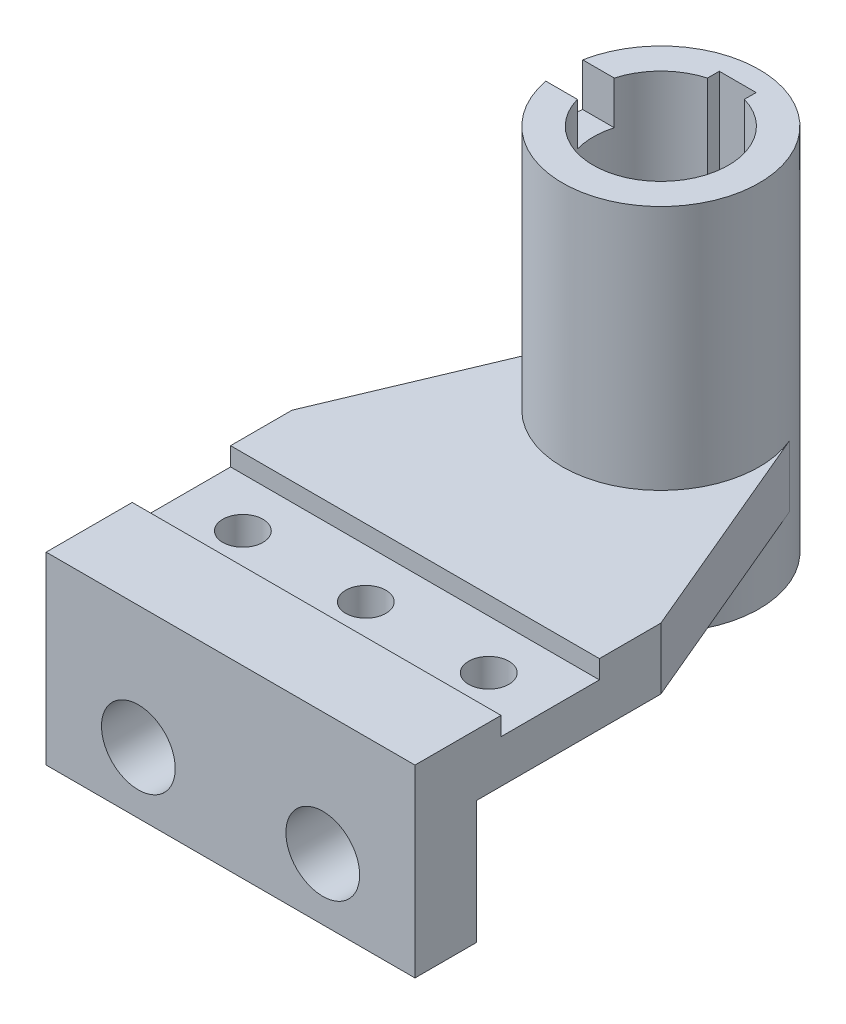
ISO-10303-21;
HEADER;
FILE_DESCRIPTION(('STEP AP214'),'2;1');
FILE_NAME('part.step','',(''),(''),'','','');
FILE_SCHEMA(('AUTOMOTIVE_DESIGN { 1 0 10303 214 1 1 1 1 }'));
ENDSEC;
DATA;
#1=APPLICATION_CONTEXT('core data for automotive mechanical design processes');
#2=APPLICATION_PROTOCOL_DEFINITION('international standard','automotive_design',2000,#1);
#3=PRODUCT_CONTEXT('',#1,'mechanical');
#4=PRODUCT('Part','Part','',(#3));
#5=PRODUCT_RELATED_PRODUCT_CATEGORY('part','',(#4));
#6=PRODUCT_DEFINITION_FORMATION('','',#4);
#7=PRODUCT_DEFINITION_CONTEXT('part definition',#1,'design');
#8=PRODUCT_DEFINITION('design','',#6,#7);
#9=PRODUCT_DEFINITION_SHAPE('','',#8);
#10=(LENGTH_UNIT() NAMED_UNIT(*) SI_UNIT(.MILLI.,.METRE.));
#11=(NAMED_UNIT(*) PLANE_ANGLE_UNIT() SI_UNIT($,.RADIAN.));
#12=(NAMED_UNIT(*) SI_UNIT($,.STERADIAN.) SOLID_ANGLE_UNIT());
#13=UNCERTAINTY_MEASURE_WITH_UNIT(LENGTH_MEASURE(1.E-05),#10,'distance_accuracy_value','');
#14=(GEOMETRIC_REPRESENTATION_CONTEXT(3) GLOBAL_UNCERTAINTY_ASSIGNED_CONTEXT((#13)) GLOBAL_UNIT_ASSIGNED_CONTEXT((#10,
#11,#12)) REPRESENTATION_CONTEXT('',''));
#15=CARTESIAN_POINT('',(0.,0.,0.));
#16=DIRECTION('',(0.,0.,1.));
#17=DIRECTION('',(1.,0.,0.));
#18=AXIS2_PLACEMENT_3D('',#15,#16,#17);
#19=CARTESIAN_POINT('',(3.64449827852106,10.,-57.1476271093349));
#20=DIRECTION('',(0.,1.,0.));
#21=DIRECTION('',(0.,0.,1.));
#22=AXIS2_PLACEMENT_3D('',#19,#20,#21);
#23=PLANE('',#22);
#24=CARTESIAN_POINT('',(3.64449827852106,10.,-57.1476271093349));
#25=DIRECTION('',(0.,1.,0.));
#26=DIRECTION('',(0.,0.,1.));
#27=AXIS2_PLACEMENT_3D('',#24,#25,#26);
#28=CIRCLE('',#27,16.);
#29=CARTESIAN_POINT('',(-11.1005058304861,10.,-63.3592978850087));
#30=VERTEX_POINT('',#29);
#31=CARTESIAN_POINT('',(18.3895023875283,10.,-63.3592978850087));
#32=VERTEX_POINT('',#31);
#33=EDGE_CURVE('E249',#30,#32,#28,.T.);
#34=ORIENTED_EDGE('',*,*,#33,.F.);
#35=DIRECTION('',(-0.388229423479616,0.,0.92156275681295));
#36=VECTOR('',#35,1.);
#37=CARTESIAN_POINT('',(-26.3555017214789,10.,-27.1476271093349));
#38=LINE('',#37,#36);
#39=CARTESIAN_POINT('',(-26.3555017214789,10.,-27.1476271093349));
#40=VERTEX_POINT('',#39);
#41=EDGE_CURVE('E376',#30,#40,#38,.T.);
#42=ORIENTED_EDGE('',*,*,#41,.T.);
#43=DIRECTION('',(0.,0.,1.));
#44=VECTOR('',#43,1.);
#45=CARTESIAN_POINT('',(-26.3555017214789,10.,12.8523728906651));
#46=LINE('',#45,#44);
#47=CARTESIAN_POINT('',(-26.3555017214789,10.,-17.1476271093349));
#48=VERTEX_POINT('',#47);
#49=EDGE_CURVE('E359',#40,#48,#46,.T.);
#50=ORIENTED_EDGE('',*,*,#49,.T.);
#51=DIRECTION('',(-1.,0.,0.));
#52=VECTOR('',#51,1.);
#53=CARTESIAN_POINT('',(-26.3555017214789,10.,-17.1476271093349));
#54=LINE('',#53,#52);
#55=CARTESIAN_POINT('',(33.6444982785211,10.,-17.1476271093349));
#56=VERTEX_POINT('',#55);
#57=EDGE_CURVE('E281',#56,#48,#54,.T.);
#58=ORIENTED_EDGE('',*,*,#57,.F.);
#59=DIRECTION('',(0.,0.,-1.));
#60=VECTOR('',#59,1.);
#61=CARTESIAN_POINT('',(33.6444982785211,10.,12.8523728906651));
#62=LINE('',#61,#60);
#63=CARTESIAN_POINT('',(33.6444982785211,10.,-27.1476271093349));
#64=VERTEX_POINT('',#63);
#65=EDGE_CURVE('E367',#56,#64,#62,.T.);
#66=ORIENTED_EDGE('',*,*,#65,.T.);
#67=DIRECTION('',(-0.388229423479617,0.,-0.92156275681295));
#68=VECTOR('',#67,1.);
#69=CARTESIAN_POINT('',(33.6444982785211,10.,-27.1476271093349));
#70=LINE('',#69,#68);
#71=EDGE_CURVE('E372',#64,#32,#70,.T.);
#72=ORIENTED_EDGE('',*,*,#71,.T.);
#73=EDGE_LOOP('',(#34,#42,#50,#58,#66,#72));
#74=FACE_BOUND('',#73,.T.);
#75=ADVANCED_FACE('F39',(#74),#23,.T.);
#76=CARTESIAN_POINT('',(3.64449827852106,0.,-57.1476271093349));
#77=DIRECTION('',(0.,1.,0.));
#78=DIRECTION('',(0.,0.,1.));
#79=AXIS2_PLACEMENT_3D('',#76,#77,#78);
#80=PLANE('',#79);
#81=CARTESIAN_POINT('',(-16.3555017214789,0.,-9.14762710933488));
#82=DIRECTION('',(0.,1.,0.));
#83=DIRECTION('',(0.,0.,1.));
#84=AXIS2_PLACEMENT_3D('',#81,#82,#83);
#85=CIRCLE('',#84,3.27082989318407);
#86=CARTESIAN_POINT('',(-16.3555017214789,0.,-5.87679721615081));
#87=VERTEX_POINT('',#86);
#88=EDGE_CURVE('E273',#87,#87,#85,.T.);
#89=ORIENTED_EDGE('',*,*,#88,.T.);
#90=EDGE_LOOP('',(#89));
#91=FACE_BOUND('',#90,.T.);
#92=CARTESIAN_POINT('',(3.64449827852107,0.,-9.14762710933488));
#93=DIRECTION('',(0.,1.,0.));
#94=DIRECTION('',(0.,0.,1.));
#95=AXIS2_PLACEMENT_3D('',#92,#93,#94);
#96=CIRCLE('',#95,3.27082989318407);
#97=CARTESIAN_POINT('',(3.64449827852107,0.,-5.87679721615081));
#98=VERTEX_POINT('',#97);
#99=EDGE_CURVE('E269',#98,#98,#96,.T.);
#100=ORIENTED_EDGE('',*,*,#99,.T.);
#101=EDGE_LOOP('',(#100));
#102=FACE_BOUND('',#101,.T.);
#103=CARTESIAN_POINT('',(23.6444982785211,0.,-9.14762710933488));
#104=DIRECTION('',(0.,1.,0.));
#105=DIRECTION('',(0.,0.,1.));
#106=AXIS2_PLACEMENT_3D('',#103,#104,#105);
#107=CIRCLE('',#106,3.27082989318407);
#108=CARTESIAN_POINT('',(23.6444982785211,0.,-5.87679721615081));
#109=VERTEX_POINT('',#108);
#110=EDGE_CURVE('E258',#109,#109,#107,.T.);
#111=ORIENTED_EDGE('',*,*,#110,.T.);
#112=EDGE_LOOP('',(#111));
#113=FACE_BOUND('',#112,.T.);
#114=DIRECTION('',(-0.388229423479616,0.,0.92156275681295));
#115=VECTOR('',#114,1.);
#116=CARTESIAN_POINT('',(-26.3555017214789,0.,-27.1476271093349));
#117=LINE('',#116,#115);
#118=CARTESIAN_POINT('',(-11.1005058304861,0.,-63.3592978850087));
#119=VERTEX_POINT('',#118);
#120=CARTESIAN_POINT('',(-26.3555017214789,0.,-27.1476271093349));
#121=VERTEX_POINT('',#120);
#122=EDGE_CURVE('E390',#119,#121,#117,.T.);
#123=ORIENTED_EDGE('',*,*,#122,.F.);
#124=CARTESIAN_POINT('',(3.64449827852106,0.,-57.1476271093349));
#125=DIRECTION('',(0.,1.,0.));
#126=DIRECTION('',(0.,0.,1.));
#127=AXIS2_PLACEMENT_3D('',#124,#125,#126);
#128=CIRCLE('',#127,16.);
#129=CARTESIAN_POINT('',(18.3895023875283,0.,-63.3592978850087));
#130=VERTEX_POINT('',#129);
#131=EDGE_CURVE('E246',#119,#130,#128,.T.);
#132=ORIENTED_EDGE('',*,*,#131,.T.);
#133=DIRECTION('',(-0.388229423479617,0.,-0.92156275681295));
#134=VECTOR('',#133,1.);
#135=CARTESIAN_POINT('',(33.6444982785211,0.,-27.1476271093349));
#136=LINE('',#135,#134);
#137=CARTESIAN_POINT('',(33.6444982785211,0.,-27.1476271093349));
#138=VERTEX_POINT('',#137);
#139=EDGE_CURVE('E386',#138,#130,#136,.T.);
#140=ORIENTED_EDGE('',*,*,#139,.F.);
#141=DIRECTION('',(0.,0.,-1.));
#142=VECTOR('',#141,1.);
#143=CARTESIAN_POINT('',(33.6444982785211,0.,12.8523728906651));
#144=LINE('',#143,#142);
#145=CARTESIAN_POINT('',(33.6444982785211,0.,2.85237289066512));
#146=VERTEX_POINT('',#145);
#147=EDGE_CURVE('E383',#146,#138,#144,.T.);
#148=ORIENTED_EDGE('',*,*,#147,.F.);
#149=DIRECTION('',(1.,0.,0.));
#150=VECTOR('',#149,1.);
#151=CARTESIAN_POINT('',(-26.3555017214789,0.,2.85237289066512));
#152=LINE('',#151,#150);
#153=CARTESIAN_POINT('',(-26.3555017214789,0.,2.85237289066512));
#154=VERTEX_POINT('',#153);
#155=EDGE_CURVE('E323',#154,#146,#152,.T.);
#156=ORIENTED_EDGE('',*,*,#155,.F.);
#157=DIRECTION('',(0.,0.,1.));
#158=VECTOR('',#157,1.);
#159=CARTESIAN_POINT('',(-26.3555017214789,0.,12.8523728906651));
#160=LINE('',#159,#158);
#161=EDGE_CURVE('E358',#121,#154,#160,.T.);
#162=ORIENTED_EDGE('',*,*,#161,.F.);
#163=EDGE_LOOP('',(#123,#132,#140,#148,#156,#162));
#164=FACE_BOUND('',#163,.T.);
#165=ADVANCED_FACE('F475',(#91,#102,#113,#164),#80,.F.);
#166=DIRECTION('',(1.,0.,0.));
#167=VECTOR('',#166,1.);
#168=CARTESIAN_POINT('',(-26.3555017214789,10.,-1.14762710933488));
#169=LINE('',#168,#167);
#170=CARTESIAN_POINT('',(-26.3555017214789,10.,-1.14762710933488));
#171=VERTEX_POINT('',#170);
#172=CARTESIAN_POINT('',(33.6444982785211,10.,-1.14762710933488));
#173=VERTEX_POINT('',#172);
#174=EDGE_CURVE('E277',#171,#173,#169,.T.);
#175=ORIENTED_EDGE('',*,*,#174,.F.);
#176=CARTESIAN_POINT('',(-26.3555017214789,10.,12.8523728906651));
#177=VERTEX_POINT('',#176);
#178=EDGE_CURVE('E364',#171,#177,#46,.T.);
#179=ORIENTED_EDGE('',*,*,#178,.T.);
#180=DIRECTION('',(1.,0.,0.));
#181=VECTOR('',#180,1.);
#182=CARTESIAN_POINT('',(-26.3555017214789,10.,12.8523728906651));
#183=LINE('',#182,#181);
#184=CARTESIAN_POINT('',(33.6444982785211,10.,12.8523728906651));
#185=VERTEX_POINT('',#184);
#186=EDGE_CURVE('E363',#177,#185,#183,.T.);
#187=ORIENTED_EDGE('',*,*,#186,.T.);
#188=EDGE_CURVE('E368',#185,#173,#62,.T.);
#189=ORIENTED_EDGE('',*,*,#188,.T.);
#190=EDGE_LOOP('',(#175,#179,#187,#189));
#191=FACE_BOUND('',#190,.T.);
#192=ADVANCED_FACE('F478',(#191),#23,.T.);
#193=CARTESIAN_POINT('',(-26.3555017214789,10.,12.8523728906651));
#194=DIRECTION('',(1.,0.,0.));
#195=DIRECTION('',(0.,0.,-1.));
#196=AXIS2_PLACEMENT_3D('',#193,#194,#195);
#197=PLANE('',#196);
#198=DIRECTION('',(0.,0.,1.));
#199=VECTOR('',#198,1.);
#200=CARTESIAN_POINT('',(-26.3555017214789,7.,-1.14762710933488));
#201=LINE('',#200,#199);
#202=CARTESIAN_POINT('',(-26.3555017214789,7.,-17.1476271093349));
#203=VERTEX_POINT('',#202);
#204=CARTESIAN_POINT('',(-26.3555017214789,7.,-1.14762710933488));
#205=VERTEX_POINT('',#204);
#206=EDGE_CURVE('E278',#203,#205,#201,.T.);
#207=ORIENTED_EDGE('',*,*,#206,.F.);
#208=DIRECTION('',(0.,1.,0.));
#209=VECTOR('',#208,1.);
#210=CARTESIAN_POINT('',(-26.3555017214789,7.,-17.1476271093349));
#211=LINE('',#210,#209);
#212=EDGE_CURVE('E296',#203,#48,#211,.T.);
#213=ORIENTED_EDGE('',*,*,#212,.T.);
#214=ORIENTED_EDGE('',*,*,#49,.F.);
#215=DIRECTION('',(0.,-1.,0.));
#216=VECTOR('',#215,1.);
#217=CARTESIAN_POINT('',(-26.3555017214789,10.,-27.1476271093349));
#218=LINE('',#217,#216);
#219=EDGE_CURVE('E379',#40,#121,#218,.T.);
#220=ORIENTED_EDGE('',*,*,#219,.T.);
#221=ORIENTED_EDGE('',*,*,#161,.T.);
#222=DIRECTION('',(0.,1.,0.));
#223=VECTOR('',#222,1.);
#224=CARTESIAN_POINT('',(-26.3555017214789,-20.,2.85237289066512));
#225=LINE('',#224,#223);
#226=CARTESIAN_POINT('',(-26.3555017214789,-20.,2.85237289066512));
#227=VERTEX_POINT('',#226);
#228=EDGE_CURVE('E342',#227,#154,#225,.T.);
#229=ORIENTED_EDGE('',*,*,#228,.F.);
#230=DIRECTION('',(0.,0.,-1.));
#231=VECTOR('',#230,1.);
#232=CARTESIAN_POINT('',(-26.3555017214789,-20.,12.8523728906651));
#233=LINE('',#232,#231);
#234=CARTESIAN_POINT('',(-26.3555017214789,-20.,12.8523728906651));
#235=VERTEX_POINT('',#234);
#236=EDGE_CURVE('E318',#235,#227,#233,.T.);
#237=ORIENTED_EDGE('',*,*,#236,.F.);
#238=DIRECTION('',(0.,-1.,0.));
#239=VECTOR('',#238,1.);
#240=CARTESIAN_POINT('',(-26.3555017214789,10.,12.8523728906651));
#241=LINE('',#240,#239);
#242=EDGE_CURVE('E184',#177,#235,#241,.T.);
#243=ORIENTED_EDGE('',*,*,#242,.F.);
#244=ORIENTED_EDGE('',*,*,#178,.F.);
#245=DIRECTION('',(0.,1.,0.));
#246=VECTOR('',#245,1.);
#247=CARTESIAN_POINT('',(-26.3555017214789,7.,-1.14762710933488));
#248=LINE('',#247,#246);
#249=EDGE_CURVE('E291',#205,#171,#248,.T.);
#250=ORIENTED_EDGE('',*,*,#249,.F.);
#251=EDGE_LOOP('',(#207,#213,#214,#220,#221,#229,#237,#243,#244,#250));
#252=FACE_BOUND('',#251,.T.);
#253=ADVANCED_FACE('F41',(#252),#197,.F.);
#254=CARTESIAN_POINT('',(-26.3555017214789,10.,12.8523728906651));
#255=DIRECTION('',(0.,0.,-1.));
#256=DIRECTION('',(-1.,0.,0.));
#257=AXIS2_PLACEMENT_3D('',#254,#255,#256);
#258=PLANE('',#257);
#259=CARTESIAN_POINT('',(-11.3555017214789,-10.,12.8523728906651));
#260=DIRECTION('',(0.,0.,1.));
#261=DIRECTION('',(1.,0.,0.));
#262=AXIS2_PLACEMENT_3D('',#259,#260,#261);
#263=CIRCLE('',#262,6.);
#264=CARTESIAN_POINT('',(-5.35550172147894,-10.,12.8523728906651));
#265=VERTEX_POINT('',#264);
#266=EDGE_CURVE('E310',#265,#265,#263,.T.);
#267=ORIENTED_EDGE('',*,*,#266,.F.);
#268=EDGE_LOOP('',(#267));
#269=FACE_BOUND('',#268,.T.);
#270=CARTESIAN_POINT('',(18.6444982785211,-10.,12.8523728906651));
#271=DIRECTION('',(0.,0.,1.));
#272=DIRECTION('',(1.,0.,0.));
#273=AXIS2_PLACEMENT_3D('',#270,#271,#272);
#274=CIRCLE('',#273,6.);
#275=CARTESIAN_POINT('',(24.6444982785211,-10.,12.8523728906651));
#276=VERTEX_POINT('',#275);
#277=EDGE_CURVE('E300',#276,#276,#274,.T.);
#278=ORIENTED_EDGE('',*,*,#277,.F.);
#279=EDGE_LOOP('',(#278));
#280=FACE_BOUND('',#279,.T.);
#281=ORIENTED_EDGE('',*,*,#242,.T.);
#282=DIRECTION('',(-1.,0.,0.));
#283=VECTOR('',#282,1.);
#284=CARTESIAN_POINT('',(-26.3555017214789,-20.,12.8523728906651));
#285=LINE('',#284,#283);
#286=CARTESIAN_POINT('',(33.6444982785211,-20.,12.8523728906651));
#287=VERTEX_POINT('',#286);
#288=EDGE_CURVE('E330',#287,#235,#285,.T.);
#289=ORIENTED_EDGE('',*,*,#288,.F.);
#290=DIRECTION('',(0.,-1.,0.));
#291=VECTOR('',#290,1.);
#292=CARTESIAN_POINT('',(33.6444982785211,10.,12.8523728906651));
#293=LINE('',#292,#291);
#294=EDGE_CURVE('E408',#185,#287,#293,.T.);
#295=ORIENTED_EDGE('',*,*,#294,.F.);
#296=ORIENTED_EDGE('',*,*,#186,.F.);
#297=EDGE_LOOP('',(#281,#289,#295,#296));
#298=FACE_BOUND('',#297,.T.);
#299=ADVANCED_FACE('F490',(#269,#280,#298),#258,.F.);
#300=CARTESIAN_POINT('',(33.6444982785211,10.,12.8523728906651));
#301=DIRECTION('',(-1.,0.,0.));
#302=DIRECTION('',(0.,0.,1.));
#303=AXIS2_PLACEMENT_3D('',#300,#301,#302);
#304=PLANE('',#303);
#305=ORIENTED_EDGE('',*,*,#65,.F.);
#306=DIRECTION('',(0.,1.,0.));
#307=VECTOR('',#306,1.);
#308=CARTESIAN_POINT('',(33.6444982785211,7.,-17.1476271093349));
#309=LINE('',#308,#307);
#310=CARTESIAN_POINT('',(33.6444982785211,7.,-17.1476271093349));
#311=VERTEX_POINT('',#310);
#312=EDGE_CURVE('E301',#311,#56,#309,.T.);
#313=ORIENTED_EDGE('',*,*,#312,.F.);
#314=DIRECTION('',(0.,0.,-1.));
#315=VECTOR('',#314,1.);
#316=CARTESIAN_POINT('',(33.6444982785211,7.,-1.14762710933488));
#317=LINE('',#316,#315);
#318=CARTESIAN_POINT('',(33.6444982785211,7.,-1.14762710933488));
#319=VERTEX_POINT('',#318);
#320=EDGE_CURVE('E284',#319,#311,#317,.T.);
#321=ORIENTED_EDGE('',*,*,#320,.F.);
#322=DIRECTION('',(0.,1.,0.));
#323=VECTOR('',#322,1.);
#324=CARTESIAN_POINT('',(33.6444982785211,7.,-1.14762710933488));
#325=LINE('',#324,#323);
#326=EDGE_CURVE('E304',#319,#173,#325,.T.);
#327=ORIENTED_EDGE('',*,*,#326,.T.);
#328=ORIENTED_EDGE('',*,*,#188,.F.);
#329=ORIENTED_EDGE('',*,*,#294,.T.);
#330=DIRECTION('',(0.,0.,1.));
#331=VECTOR('',#330,1.);
#332=CARTESIAN_POINT('',(33.6444982785211,-20.,12.8523728906651));
#333=LINE('',#332,#331);
#334=CARTESIAN_POINT('',(33.6444982785211,-20.,2.85237289066512));
#335=VERTEX_POINT('',#334);
#336=EDGE_CURVE('E326',#335,#287,#333,.T.);
#337=ORIENTED_EDGE('',*,*,#336,.F.);
#338=DIRECTION('',(0.,1.,0.));
#339=VECTOR('',#338,1.);
#340=CARTESIAN_POINT('',(33.6444982785211,-20.,2.85237289066512));
#341=LINE('',#340,#339);
#342=EDGE_CURVE('E334',#335,#146,#341,.T.);
#343=ORIENTED_EDGE('',*,*,#342,.T.);
#344=ORIENTED_EDGE('',*,*,#147,.T.);
#345=DIRECTION('',(0.,-1.,0.));
#346=VECTOR('',#345,1.);
#347=CARTESIAN_POINT('',(33.6444982785211,10.,-27.1476271093349));
#348=LINE('',#347,#346);
#349=EDGE_CURVE('E404',#64,#138,#348,.T.);
#350=ORIENTED_EDGE('',*,*,#349,.F.);
#351=EDGE_LOOP('',(#305,#313,#321,#327,#328,#329,#337,#343,#344,#350));
#352=FACE_BOUND('',#351,.T.);
#353=ADVANCED_FACE('F471',(#352),#304,.F.);
#354=CARTESIAN_POINT('',(33.6444982785211,10.,-27.1476271093349));
#355=DIRECTION('',(-0.92156275681295,0.,0.388229423479617));
#356=DIRECTION('',(0.388229423479617,0.,0.92156275681295));
#357=AXIS2_PLACEMENT_3D('',#354,#355,#356);
#358=PLANE('',#357);
#359=ORIENTED_EDGE('',*,*,#139,.T.);
#360=DIRECTION('',(0.,-1.,0.));
#361=VECTOR('',#360,1.);
#362=CARTESIAN_POINT('',(18.3895023875283,10.,-63.3592978850087));
#363=LINE('',#362,#361);
#364=EDGE_CURVE('E400',#32,#130,#363,.T.);
#365=ORIENTED_EDGE('',*,*,#364,.F.);
#366=ORIENTED_EDGE('',*,*,#71,.F.);
#367=ORIENTED_EDGE('',*,*,#349,.T.);
#368=EDGE_LOOP('',(#359,#365,#366,#367));
#369=FACE_BOUND('',#368,.T.);
#370=ADVANCED_FACE('F461',(#369),#358,.F.);
#371=CARTESIAN_POINT('',(3.64449827852106,10.,-57.1476271093349));
#372=DIRECTION('',(0.,-1.,0.));
#373=DIRECTION('',(0.,0.,-1.));
#374=AXIS2_PLACEMENT_3D('',#371,#372,#373);
#375=CYLINDRICAL_SURFACE('',#374,16.);
#376=ORIENTED_EDGE('',*,*,#364,.T.);
#377=ORIENTED_EDGE('',*,*,#131,.F.);
#378=DIRECTION('',(0.,-1.,0.));
#379=VECTOR('',#378,1.);
#380=CARTESIAN_POINT('',(-11.1005058304861,10.,-63.3592978850087));
#381=LINE('',#380,#379);
#382=EDGE_CURVE('E396',#30,#119,#381,.T.);
#383=ORIENTED_EDGE('',*,*,#382,.F.);
#384=ORIENTED_EDGE('',*,*,#33,.T.);
#385=EDGE_LOOP('',(#376,#377,#383,#384));
#386=FACE_BOUND('',#385,.T.);
#387=CARTESIAN_POINT('',(3.64449827852106,-10.,-57.1476271093349));
#388=DIRECTION('',(0.,1.,0.));
#389=DIRECTION('',(0.,0.,1.));
#390=AXIS2_PLACEMENT_3D('',#387,#388,#389);
#391=CIRCLE('',#390,16.);
#392=CARTESIAN_POINT('',(3.64449827852106,-10.,-41.1476271093349));
#393=VERTEX_POINT('',#392);
#394=EDGE_CURVE('E242',#393,#393,#391,.T.);
#395=ORIENTED_EDGE('',*,*,#394,.T.);
#396=EDGE_LOOP('',(#395));
#397=FACE_BOUND('',#396,.T.);
#398=CARTESIAN_POINT('',(3.64449827852106,43.,-57.1476271093349));
#399=DIRECTION('',(0.,-1.,0.));
#400=DIRECTION('',(0.,0.,-1.));
#401=AXIS2_PLACEMENT_3D('',#398,#399,#400);
#402=CIRCLE('',#401,16.);
#403=CARTESIAN_POINT('',(-12.0717353669806,43.,-54.1476271093348));
#404=VERTEX_POINT('',#403);
#405=CARTESIAN_POINT('',(-12.0717353669807,43.,-60.1476271093348));
#406=VERTEX_POINT('',#405);
#407=EDGE_CURVE('E203',#404,#406,#402,.T.);
#408=ORIENTED_EDGE('',*,*,#407,.T.);
#409=DIRECTION('',(0.,-1.,0.));
#410=VECTOR('',#409,1.);
#411=CARTESIAN_POINT('',(-12.0717353669807,10.,-60.1476271093348));
#412=LINE('',#411,#410);
#413=CARTESIAN_POINT('',(-12.0717353669807,50.,-60.1476271093348));
#414=VERTEX_POINT('',#413);
#415=EDGE_CURVE('E209',#406,#414,#412,.F.);
#416=ORIENTED_EDGE('',*,*,#415,.T.);
#417=CARTESIAN_POINT('',(3.64449827852106,50.,-57.1476271093349));
#418=DIRECTION('',(0.,1.,0.));
#419=DIRECTION('',(0.,0.,1.));
#420=AXIS2_PLACEMENT_3D('',#417,#418,#419);
#421=CIRCLE('',#420,16.);
#422=CARTESIAN_POINT('',(-12.0717353669806,50.,-54.1476271093348));
#423=VERTEX_POINT('',#422);
#424=EDGE_CURVE('E223',#423,#414,#421,.T.);
#425=ORIENTED_EDGE('',*,*,#424,.F.);
#426=DIRECTION('',(0.,-1.,0.));
#427=VECTOR('',#426,1.);
#428=CARTESIAN_POINT('',(-12.0717353669806,10.,-54.1476271093348));
#429=LINE('',#428,#427);
#430=EDGE_CURVE('E55',#423,#404,#429,.T.);
#431=ORIENTED_EDGE('',*,*,#430,.T.);
#432=EDGE_LOOP('',(#408,#416,#425,#431));
#433=FACE_BOUND('',#432,.T.);
#434=ADVANCED_FACE('F427',(#386,#397,#433),#375,.T.);
#435=CARTESIAN_POINT('',(-26.3555017214789,10.,-27.1476271093349));
#436=DIRECTION('',(0.92156275681295,0.,0.388229423479616));
#437=DIRECTION('',(0.388229423479616,0.,-0.92156275681295));
#438=AXIS2_PLACEMENT_3D('',#435,#436,#437);
#439=PLANE('',#438);
#440=ORIENTED_EDGE('',*,*,#122,.T.);
#441=ORIENTED_EDGE('',*,*,#219,.F.);
#442=ORIENTED_EDGE('',*,*,#41,.F.);
#443=ORIENTED_EDGE('',*,*,#382,.T.);
#444=EDGE_LOOP('',(#440,#441,#442,#443));
#445=FACE_BOUND('',#444,.T.);
#446=ADVANCED_FACE('F460',(#445),#439,.F.);
#447=CARTESIAN_POINT('',(-26.3555017214789,-20.,2.85237289066512));
#448=DIRECTION('',(0.,0.,1.));
#449=DIRECTION('',(1.,0.,0.));
#450=AXIS2_PLACEMENT_3D('',#447,#448,#449);
#451=PLANE('',#450);
#452=CARTESIAN_POINT('',(-11.3555017214789,-10.,2.85237289066512));
#453=DIRECTION('',(0.,0.,1.));
#454=DIRECTION('',(1.,0.,0.));
#455=AXIS2_PLACEMENT_3D('',#452,#453,#454);
#456=CIRCLE('',#455,6.);
#457=CARTESIAN_POINT('',(-5.35550172147894,-10.,2.85237289066512));
#458=VERTEX_POINT('',#457);
#459=EDGE_CURVE('E338',#458,#458,#456,.T.);
#460=ORIENTED_EDGE('',*,*,#459,.T.);
#461=EDGE_LOOP('',(#460));
#462=FACE_BOUND('',#461,.T.);
#463=CARTESIAN_POINT('',(18.6444982785211,-10.,2.85237289066512));
#464=DIRECTION('',(0.,0.,1.));
#465=DIRECTION('',(1.,0.,0.));
#466=AXIS2_PLACEMENT_3D('',#463,#464,#465);
#467=CIRCLE('',#466,6.);
#468=CARTESIAN_POINT('',(24.6444982785211,-10.,2.85237289066512));
#469=VERTEX_POINT('',#468);
#470=EDGE_CURVE('E314',#469,#469,#467,.T.);
#471=ORIENTED_EDGE('',*,*,#470,.T.);
#472=EDGE_LOOP('',(#471));
#473=FACE_BOUND('',#472,.T.);
#474=ORIENTED_EDGE('',*,*,#155,.T.);
#475=ORIENTED_EDGE('',*,*,#342,.F.);
#476=DIRECTION('',(1.,0.,0.));
#477=VECTOR('',#476,1.);
#478=CARTESIAN_POINT('',(-26.3555017214789,-20.,2.85237289066512));
#479=LINE('',#478,#477);
#480=EDGE_CURVE('E322',#227,#335,#479,.T.);
#481=ORIENTED_EDGE('',*,*,#480,.F.);
#482=ORIENTED_EDGE('',*,*,#228,.T.);
#483=EDGE_LOOP('',(#474,#475,#481,#482));
#484=FACE_BOUND('',#483,.T.);
#485=ADVANCED_FACE('F468',(#462,#473,#484),#451,.F.);
#486=CARTESIAN_POINT('',(0.,-20.,0.));
#487=DIRECTION('',(0.,-1.,0.));
#488=DIRECTION('',(0.,0.,-1.));
#489=AXIS2_PLACEMENT_3D('',#486,#487,#488);
#490=PLANE('',#489);
#491=ORIENTED_EDGE('',*,*,#236,.T.);
#492=ORIENTED_EDGE('',*,*,#480,.T.);
#493=ORIENTED_EDGE('',*,*,#336,.T.);
#494=ORIENTED_EDGE('',*,*,#288,.T.);
#495=EDGE_LOOP('',(#491,#492,#493,#494));
#496=FACE_BOUND('',#495,.T.);
#497=ADVANCED_FACE('F540',(#496),#490,.T.);
#498=CARTESIAN_POINT('',(18.6444982785211,-10.,-7.14762710933488));
#499=DIRECTION('',(0.,0.,1.));
#500=DIRECTION('',(1.,0.,0.));
#501=AXIS2_PLACEMENT_3D('',#498,#499,#500);
#502=CYLINDRICAL_SURFACE('',#501,6.);
#503=ORIENTED_EDGE('',*,*,#277,.T.);
#504=EDGE_LOOP('',(#503));
#505=FACE_BOUND('',#504,.T.);
#506=ORIENTED_EDGE('',*,*,#470,.F.);
#507=EDGE_LOOP('',(#506));
#508=FACE_BOUND('',#507,.T.);
#509=ADVANCED_FACE('F536',(#505,#508),#502,.F.);
#510=CARTESIAN_POINT('',(-11.3555017214789,-10.,-7.14762710933488));
#511=DIRECTION('',(0.,0.,1.));
#512=DIRECTION('',(1.,0.,0.));
#513=AXIS2_PLACEMENT_3D('',#510,#511,#512);
#514=CYLINDRICAL_SURFACE('',#513,6.);
#515=ORIENTED_EDGE('',*,*,#266,.T.);
#516=EDGE_LOOP('',(#515));
#517=FACE_BOUND('',#516,.T.);
#518=ORIENTED_EDGE('',*,*,#459,.F.);
#519=EDGE_LOOP('',(#518));
#520=FACE_BOUND('',#519,.T.);
#521=ADVANCED_FACE('F531',(#517,#520),#514,.F.);
#522=CARTESIAN_POINT('',(-26.3555017214789,7.,-17.1476271093349));
#523=DIRECTION('',(0.,0.,-1.));
#524=DIRECTION('',(-1.,0.,0.));
#525=AXIS2_PLACEMENT_3D('',#522,#523,#524);
#526=PLANE('',#525);
#527=ORIENTED_EDGE('',*,*,#57,.T.);
#528=ORIENTED_EDGE('',*,*,#212,.F.);
#529=DIRECTION('',(-1.,0.,0.));
#530=VECTOR('',#529,1.);
#531=CARTESIAN_POINT('',(-26.3555017214789,7.,-17.1476271093349));
#532=LINE('',#531,#530);
#533=EDGE_CURVE('E287',#311,#203,#532,.T.);
#534=ORIENTED_EDGE('',*,*,#533,.F.);
#535=ORIENTED_EDGE('',*,*,#312,.T.);
#536=EDGE_LOOP('',(#527,#528,#534,#535));
#537=FACE_BOUND('',#536,.T.);
#538=ADVANCED_FACE('F518',(#537),#526,.F.);
#539=CARTESIAN_POINT('',(-26.3555017214789,7.,-1.14762710933488));
#540=DIRECTION('',(0.,0.,1.));
#541=DIRECTION('',(1.,0.,0.));
#542=AXIS2_PLACEMENT_3D('',#539,#540,#541);
#543=PLANE('',#542);
#544=ORIENTED_EDGE('',*,*,#174,.T.);
#545=ORIENTED_EDGE('',*,*,#326,.F.);
#546=DIRECTION('',(1.,0.,0.));
#547=VECTOR('',#546,1.);
#548=CARTESIAN_POINT('',(-26.3555017214789,7.,-1.14762710933488));
#549=LINE('',#548,#547);
#550=EDGE_CURVE('E63',#205,#319,#549,.T.);
#551=ORIENTED_EDGE('',*,*,#550,.F.);
#552=ORIENTED_EDGE('',*,*,#249,.T.);
#553=EDGE_LOOP('',(#544,#545,#551,#552));
#554=FACE_BOUND('',#553,.T.);
#555=ADVANCED_FACE('F521',(#554),#543,.F.);
#556=CARTESIAN_POINT('',(0.,7.,0.));
#557=DIRECTION('',(0.,-1.,0.));
#558=DIRECTION('',(0.,0.,-1.));
#559=AXIS2_PLACEMENT_3D('',#556,#557,#558);
#560=PLANE('',#559);
#561=CARTESIAN_POINT('',(-16.3555017214789,7.,-9.14762710933488));
#562=DIRECTION('',(0.,1.,0.));
#563=DIRECTION('',(0.,0.,1.));
#564=AXIS2_PLACEMENT_3D('',#561,#562,#563);
#565=CIRCLE('',#564,3.27082989318407);
#566=CARTESIAN_POINT('',(-16.3555017214789,7.,-5.87679721615081));
#567=VERTEX_POINT('',#566);
#568=EDGE_CURVE('E254',#567,#567,#565,.T.);
#569=ORIENTED_EDGE('',*,*,#568,.F.);
#570=EDGE_LOOP('',(#569));
#571=FACE_BOUND('',#570,.T.);
#572=CARTESIAN_POINT('',(3.64449827852107,7.,-9.14762710933488));
#573=DIRECTION('',(0.,1.,0.));
#574=DIRECTION('',(0.,0.,1.));
#575=AXIS2_PLACEMENT_3D('',#572,#573,#574);
#576=CIRCLE('',#575,3.27082989318407);
#577=CARTESIAN_POINT('',(3.64449827852107,7.,-5.87679721615081));
#578=VERTEX_POINT('',#577);
#579=EDGE_CURVE('E259',#578,#578,#576,.T.);
#580=ORIENTED_EDGE('',*,*,#579,.F.);
#581=EDGE_LOOP('',(#580));
#582=FACE_BOUND('',#581,.T.);
#583=CARTESIAN_POINT('',(23.6444982785211,7.,-9.14762710933488));
#584=DIRECTION('',(0.,1.,0.));
#585=DIRECTION('',(0.,0.,1.));
#586=AXIS2_PLACEMENT_3D('',#583,#584,#585);
#587=CIRCLE('',#586,3.27082989318407);
#588=CARTESIAN_POINT('',(23.6444982785211,7.,-5.87679721615081));
#589=VERTEX_POINT('',#588);
#590=EDGE_CURVE('E253',#589,#589,#587,.T.);
#591=ORIENTED_EDGE('',*,*,#590,.F.);
#592=EDGE_LOOP('',(#591));
#593=FACE_BOUND('',#592,.T.);
#594=ORIENTED_EDGE('',*,*,#206,.T.);
#595=ORIENTED_EDGE('',*,*,#550,.T.);
#596=ORIENTED_EDGE('',*,*,#320,.T.);
#597=ORIENTED_EDGE('',*,*,#533,.T.);
#598=EDGE_LOOP('',(#594,#595,#596,#597));
#599=FACE_BOUND('',#598,.T.);
#600=ADVANCED_FACE('F519',(#571,#582,#593,#599),#560,.F.);
#601=CARTESIAN_POINT('',(23.6444982785211,-13.,-9.14762710933488));
#602=DIRECTION('',(0.,1.,0.));
#603=DIRECTION('',(0.,0.,1.));
#604=AXIS2_PLACEMENT_3D('',#601,#602,#603);
#605=CYLINDRICAL_SURFACE('',#604,3.27082989318407);
#606=ORIENTED_EDGE('',*,*,#590,.T.);
#607=EDGE_LOOP('',(#606));
#608=FACE_BOUND('',#607,.T.);
#609=ORIENTED_EDGE('',*,*,#110,.F.);
#610=EDGE_LOOP('',(#609));
#611=FACE_BOUND('',#610,.T.);
#612=ADVANCED_FACE('F528',(#608,#611),#605,.F.);
#613=CARTESIAN_POINT('',(3.64449827852107,-13.,-9.14762710933488));
#614=DIRECTION('',(0.,1.,0.));
#615=DIRECTION('',(0.,0.,1.));
#616=AXIS2_PLACEMENT_3D('',#613,#614,#615);
#617=CYLINDRICAL_SURFACE('',#616,3.27082989318407);
#618=ORIENTED_EDGE('',*,*,#579,.T.);
#619=EDGE_LOOP('',(#618));
#620=FACE_BOUND('',#619,.T.);
#621=ORIENTED_EDGE('',*,*,#99,.F.);
#622=EDGE_LOOP('',(#621));
#623=FACE_BOUND('',#622,.T.);
#624=ADVANCED_FACE('F643',(#620,#623),#617,.F.);
#625=CARTESIAN_POINT('',(-16.3555017214789,-13.,-9.14762710933488));
#626=DIRECTION('',(0.,1.,0.));
#627=DIRECTION('',(0.,0.,1.));
#628=AXIS2_PLACEMENT_3D('',#625,#626,#627);
#629=CYLINDRICAL_SURFACE('',#628,3.27082989318407);
#630=ORIENTED_EDGE('',*,*,#568,.T.);
#631=EDGE_LOOP('',(#630));
#632=FACE_BOUND('',#631,.T.);
#633=ORIENTED_EDGE('',*,*,#88,.F.);
#634=EDGE_LOOP('',(#633));
#635=FACE_BOUND('',#634,.T.);
#636=ADVANCED_FACE('F455',(#632,#635),#629,.F.);
#637=CARTESIAN_POINT('',(3.64449827852106,-10.,-57.1476271093349));
#638=DIRECTION('',(0.,1.,0.));
#639=DIRECTION('',(0.,0.,1.));
#640=AXIS2_PLACEMENT_3D('',#637,#638,#639);
#641=PLANE('',#640);
#642=DIRECTION('',(0.,0.,1.));
#643=VECTOR('',#642,1.);
#644=CARTESIAN_POINT('',(0.644498278521059,-10.,-69.6476271093349));
#645=LINE('',#644,#643);
#646=CARTESIAN_POINT('',(0.644498278521059,-10.,-69.6476271093349));
#647=VERTEX_POINT('',#646);
#648=CARTESIAN_POINT('',(0.644498278521065,-10.,-67.7306323535932));
#649=VERTEX_POINT('',#648);
#650=EDGE_CURVE('E238',#647,#649,#645,.T.);
#651=ORIENTED_EDGE('',*,*,#650,.T.);
#652=CARTESIAN_POINT('',(3.64449827852106,-10.,-57.1476271093349));
#653=DIRECTION('',(0.,1.,0.));
#654=DIRECTION('',(0.,0.,1.));
#655=AXIS2_PLACEMENT_3D('',#652,#653,#654);
#656=CIRCLE('',#655,11.);
#657=CARTESIAN_POINT('',(6.64449827852106,-10.,-67.7306323535932));
#658=VERTEX_POINT('',#657);
#659=EDGE_CURVE('E226',#649,#658,#656,.T.);
#660=ORIENTED_EDGE('',*,*,#659,.T.);
#661=DIRECTION('',(0.,0.,-1.));
#662=VECTOR('',#661,1.);
#663=CARTESIAN_POINT('',(6.64449827852106,-10.,-67.7306323535932));
#664=LINE('',#663,#662);
#665=CARTESIAN_POINT('',(6.64449827852106,-10.,-69.6476271093349));
#666=VERTEX_POINT('',#665);
#667=EDGE_CURVE('E230',#658,#666,#664,.T.);
#668=ORIENTED_EDGE('',*,*,#667,.T.);
#669=DIRECTION('',(-1.,0.,0.));
#670=VECTOR('',#669,1.);
#671=CARTESIAN_POINT('',(6.64449827852106,-10.,-69.6476271093349));
#672=LINE('',#671,#670);
#673=EDGE_CURVE('E234',#666,#647,#672,.T.);
#674=ORIENTED_EDGE('',*,*,#673,.T.);
#675=EDGE_LOOP('',(#651,#660,#668,#674));
#676=FACE_BOUND('',#675,.T.);
#677=ORIENTED_EDGE('',*,*,#394,.F.);
#678=EDGE_LOOP('',(#677));
#679=FACE_BOUND('',#678,.T.);
#680=ADVANCED_FACE('F452',(#676,#679),#641,.F.);
#681=CARTESIAN_POINT('',(6.64449827852106,10.,-69.6476271093349));
#682=DIRECTION('',(-1.,0.,0.));
#683=DIRECTION('',(0.,0.,1.));
#684=AXIS2_PLACEMENT_3D('',#681,#682,#683);
#685=PLANE('',#684);
#686=DIRECTION('',(0.,-1.,0.));
#687=VECTOR('',#686,1.);
#688=CARTESIAN_POINT('',(6.64449827852106,10.,-69.6476271093349));
#689=LINE('',#688,#687);
#690=CARTESIAN_POINT('',(6.64449827852106,50.,-69.6476271093349));
#691=VERTEX_POINT('',#690);
#692=EDGE_CURVE('E349',#691,#666,#689,.T.);
#693=ORIENTED_EDGE('',*,*,#692,.T.);
#694=ORIENTED_EDGE('',*,*,#667,.F.);
#695=DIRECTION('',(0.,-1.,0.));
#696=VECTOR('',#695,1.);
#697=CARTESIAN_POINT('',(6.64449827852106,10.,-67.7306323535932));
#698=LINE('',#697,#696);
#699=CARTESIAN_POINT('',(6.64449827852106,50.,-67.7306323535932));
#700=VERTEX_POINT('',#699);
#701=EDGE_CURVE('E352',#700,#658,#698,.T.);
#702=ORIENTED_EDGE('',*,*,#701,.F.);
#703=DIRECTION('',(0.,0.,-1.));
#704=VECTOR('',#703,1.);
#705=CARTESIAN_POINT('',(6.64449827852106,50.,-67.7306323535932));
#706=LINE('',#705,#704);
#707=EDGE_CURVE('E200',#700,#691,#706,.T.);
#708=ORIENTED_EDGE('',*,*,#707,.T.);
#709=EDGE_LOOP('',(#693,#694,#702,#708));
#710=FACE_BOUND('',#709,.T.);
#711=ADVANCED_FACE('F450',(#710),#685,.T.);
#712=CARTESIAN_POINT('',(0.644498278521059,10.,-69.6476271093349));
#713=DIRECTION('',(0.,0.,1.));
#714=DIRECTION('',(1.,0.,0.));
#715=AXIS2_PLACEMENT_3D('',#712,#713,#714);
#716=PLANE('',#715);
#717=DIRECTION('',(0.,-1.,0.));
#718=VECTOR('',#717,1.);
#719=CARTESIAN_POINT('',(0.644498278521059,10.,-69.6476271093349));
#720=LINE('',#719,#718);
#721=CARTESIAN_POINT('',(0.644498278521059,50.,-69.6476271093349));
#722=VERTEX_POINT('',#721);
#723=EDGE_CURVE('E346',#722,#647,#720,.T.);
#724=ORIENTED_EDGE('',*,*,#723,.T.);
#725=ORIENTED_EDGE('',*,*,#673,.F.);
#726=ORIENTED_EDGE('',*,*,#692,.F.);
#727=DIRECTION('',(-1.,0.,0.));
#728=VECTOR('',#727,1.);
#729=CARTESIAN_POINT('',(6.64449827852106,50.,-69.6476271093349));
#730=LINE('',#729,#728);
#731=EDGE_CURVE('E215',#691,#722,#730,.T.);
#732=ORIENTED_EDGE('',*,*,#731,.T.);
#733=EDGE_LOOP('',(#724,#725,#726,#732));
#734=FACE_BOUND('',#733,.T.);
#735=ADVANCED_FACE('F447',(#734),#716,.T.);
#736=CARTESIAN_POINT('',(0.644498278521059,10.,-69.6476271093349));
#737=DIRECTION('',(1.,0.,0.));
#738=DIRECTION('',(0.,0.,-1.));
#739=AXIS2_PLACEMENT_3D('',#736,#737,#738);
#740=PLANE('',#739);
#741=DIRECTION('',(0.,-1.,0.));
#742=VECTOR('',#741,1.);
#743=CARTESIAN_POINT('',(0.644498278521065,10.,-67.7306323535932));
#744=LINE('',#743,#742);
#745=CARTESIAN_POINT('',(0.644498278521065,50.,-67.7306323535932));
#746=VERTEX_POINT('',#745);
#747=EDGE_CURVE('E355',#746,#649,#744,.T.);
#748=ORIENTED_EDGE('',*,*,#747,.T.);
#749=ORIENTED_EDGE('',*,*,#650,.F.);
#750=ORIENTED_EDGE('',*,*,#723,.F.);
#751=DIRECTION('',(0.,0.,1.));
#752=VECTOR('',#751,1.);
#753=CARTESIAN_POINT('',(0.644498278521059,50.,-69.6476271093349));
#754=LINE('',#753,#752);
#755=EDGE_CURVE('E219',#722,#746,#754,.T.);
#756=ORIENTED_EDGE('',*,*,#755,.T.);
#757=EDGE_LOOP('',(#748,#749,#750,#756));
#758=FACE_BOUND('',#757,.T.);
#759=ADVANCED_FACE('F443',(#758),#740,.T.);
#760=CARTESIAN_POINT('',(3.64449827852106,10.,-57.1476271093349));
#761=DIRECTION('',(0.,-1.,0.));
#762=DIRECTION('',(0.,0.,-1.));
#763=AXIS2_PLACEMENT_3D('',#760,#761,#762);
#764=CYLINDRICAL_SURFACE('',#763,11.);
#765=DIRECTION('',(0.,-1.,0.));
#766=VECTOR('',#765,1.);
#767=CARTESIAN_POINT('',(-6.93850696573732,10.,-60.1476271093348));
#768=LINE('',#767,#766);
#769=CARTESIAN_POINT('',(-6.93850696573732,43.,-60.1476271093348));
#770=VERTEX_POINT('',#769);
#771=CARTESIAN_POINT('',(-6.93850696573732,50.,-60.1476271093348));
#772=VERTEX_POINT('',#771);
#773=EDGE_CURVE('E424',#770,#772,#768,.F.);
#774=ORIENTED_EDGE('',*,*,#773,.F.);
#775=CARTESIAN_POINT('',(3.64449827852106,43.,-57.1476271093349));
#776=DIRECTION('',(0.,-1.,0.));
#777=DIRECTION('',(0.,0.,-1.));
#778=AXIS2_PLACEMENT_3D('',#775,#776,#777);
#779=CIRCLE('',#778,11.);
#780=CARTESIAN_POINT('',(-6.93850696573728,43.,-54.1476271093348));
#781=VERTEX_POINT('',#780);
#782=EDGE_CURVE('E11',#781,#770,#779,.T.);
#783=ORIENTED_EDGE('',*,*,#782,.F.);
#784=DIRECTION('',(0.,-1.,0.));
#785=VECTOR('',#784,1.);
#786=CARTESIAN_POINT('',(-6.93850696573728,10.,-54.1476271093348));
#787=LINE('',#786,#785);
#788=CARTESIAN_POINT('',(-6.93850696573728,50.,-54.1476271093348));
#789=VERTEX_POINT('',#788);
#790=EDGE_CURVE('E177',#789,#781,#787,.T.);
#791=ORIENTED_EDGE('',*,*,#790,.F.);
#792=CARTESIAN_POINT('',(3.64449827852106,50.,-57.1476271093349));
#793=DIRECTION('',(0.,1.,0.));
#794=DIRECTION('',(0.,0.,1.));
#795=AXIS2_PLACEMENT_3D('',#792,#793,#794);
#796=CIRCLE('',#795,11.);
#797=EDGE_CURVE('E190',#789,#700,#796,.T.);
#798=ORIENTED_EDGE('',*,*,#797,.T.);
#799=ORIENTED_EDGE('',*,*,#701,.T.);
#800=ORIENTED_EDGE('',*,*,#659,.F.);
#801=ORIENTED_EDGE('',*,*,#747,.F.);
#802=EDGE_CURVE('E202',#746,#772,#796,.T.);
#803=ORIENTED_EDGE('',*,*,#802,.T.);
#804=EDGE_LOOP('',(#774,#783,#791,#798,#799,#800,#801,#803));
#805=FACE_BOUND('',#804,.T.);
#806=ADVANCED_FACE('F189',(#805),#764,.F.);
#807=CARTESIAN_POINT('',(3.64449827852106,50.,-57.1476271093349));
#808=DIRECTION('',(0.,1.,0.));
#809=DIRECTION('',(0.,0.,1.));
#810=AXIS2_PLACEMENT_3D('',#807,#808,#809);
#811=PLANE('',#810);
#812=DIRECTION('',(-1.,0.,0.));
#813=VECTOR('',#812,1.);
#814=CARTESIAN_POINT('',(3.64449827852106,50.,-60.1476271093348));
#815=LINE('',#814,#813);
#816=EDGE_CURVE('E48',#772,#414,#815,.T.);
#817=ORIENTED_EDGE('',*,*,#816,.F.);
#818=ORIENTED_EDGE('',*,*,#802,.F.);
#819=ORIENTED_EDGE('',*,*,#755,.F.);
#820=ORIENTED_EDGE('',*,*,#731,.F.);
#821=ORIENTED_EDGE('',*,*,#707,.F.);
#822=ORIENTED_EDGE('',*,*,#797,.F.);
#823=DIRECTION('',(1.,0.,0.));
#824=VECTOR('',#823,1.);
#825=CARTESIAN_POINT('',(3.64449827852106,50.,-54.1476271093348));
#826=LINE('',#825,#824);
#827=EDGE_CURVE('E174',#423,#789,#826,.T.);
#828=ORIENTED_EDGE('',*,*,#827,.F.);
#829=ORIENTED_EDGE('',*,*,#424,.T.);
#830=EDGE_LOOP('',(#817,#818,#819,#820,#821,#822,#828,#829));
#831=FACE_BOUND('',#830,.T.);
#832=ADVANCED_FACE('F197',(#831),#811,.T.);
#833=CARTESIAN_POINT('',(0.,43.,0.));
#834=DIRECTION('',(0.,-1.,0.));
#835=DIRECTION('',(0.,0.,-1.));
#836=AXIS2_PLACEMENT_3D('',#833,#834,#835);
#837=PLANE('',#836);
#838=DIRECTION('',(1.,0.,0.));
#839=VECTOR('',#838,1.);
#840=CARTESIAN_POINT('',(-0.93203469991867,43.,-54.1476271093348));
#841=LINE('',#840,#839);
#842=EDGE_CURVE('E436',#404,#781,#841,.T.);
#843=ORIENTED_EDGE('',*,*,#842,.T.);
#844=ORIENTED_EDGE('',*,*,#782,.T.);
#845=DIRECTION('',(-1.,0.,0.));
#846=VECTOR('',#845,1.);
#847=CARTESIAN_POINT('',(-0.93203469991867,43.,-60.1476271093348));
#848=LINE('',#847,#846);
#849=EDGE_CURVE('E193',#770,#406,#848,.T.);
#850=ORIENTED_EDGE('',*,*,#849,.T.);
#851=ORIENTED_EDGE('',*,*,#407,.F.);
#852=EDGE_LOOP('',(#843,#844,#850,#851));
#853=FACE_BOUND('',#852,.T.);
#854=ADVANCED_FACE('F439',(#853),#837,.F.);
#855=CARTESIAN_POINT('',(-0.93203469991867,43.,-60.1476271093348));
#856=DIRECTION('',(0.,0.,-1.));
#857=DIRECTION('',(-1.,0.,0.));
#858=AXIS2_PLACEMENT_3D('',#855,#856,#857);
#859=PLANE('',#858);
#860=ORIENTED_EDGE('',*,*,#849,.F.);
#861=ORIENTED_EDGE('',*,*,#773,.T.);
#862=ORIENTED_EDGE('',*,*,#816,.T.);
#863=ORIENTED_EDGE('',*,*,#415,.F.);
#864=EDGE_LOOP('',(#860,#861,#862,#863));
#865=FACE_BOUND('',#864,.T.);
#866=ADVANCED_FACE('F422',(#865),#859,.F.);
#867=CARTESIAN_POINT('',(-0.93203469991867,43.,-54.1476271093348));
#868=DIRECTION('',(0.,0.,1.));
#869=DIRECTION('',(1.,0.,0.));
#870=AXIS2_PLACEMENT_3D('',#867,#868,#869);
#871=PLANE('',#870);
#872=ORIENTED_EDGE('',*,*,#827,.T.);
#873=ORIENTED_EDGE('',*,*,#790,.T.);
#874=ORIENTED_EDGE('',*,*,#842,.F.);
#875=ORIENTED_EDGE('',*,*,#430,.F.);
#876=EDGE_LOOP('',(#872,#873,#874,#875));
#877=FACE_BOUND('',#876,.T.);
#878=ADVANCED_FACE('F176',(#877),#871,.F.);
#879=CLOSED_SHELL('',(#75,#165,#192,#253,#299,#353,#370,#434,#446,#485,#497,#509,#521,#538,#555,
#600,#612,#624,#636,#680,#711,#735,#759,#806,#832,#854,#866,#878));
#880=MANIFOLD_SOLID_BREP('B2',#879);
#881=ADVANCED_BREP_SHAPE_REPRESENTATION('',(#18,#880),#14);
#882=SHAPE_DEFINITION_REPRESENTATION(#9,#881);
ENDSEC;
END-ISO-10303-21;
